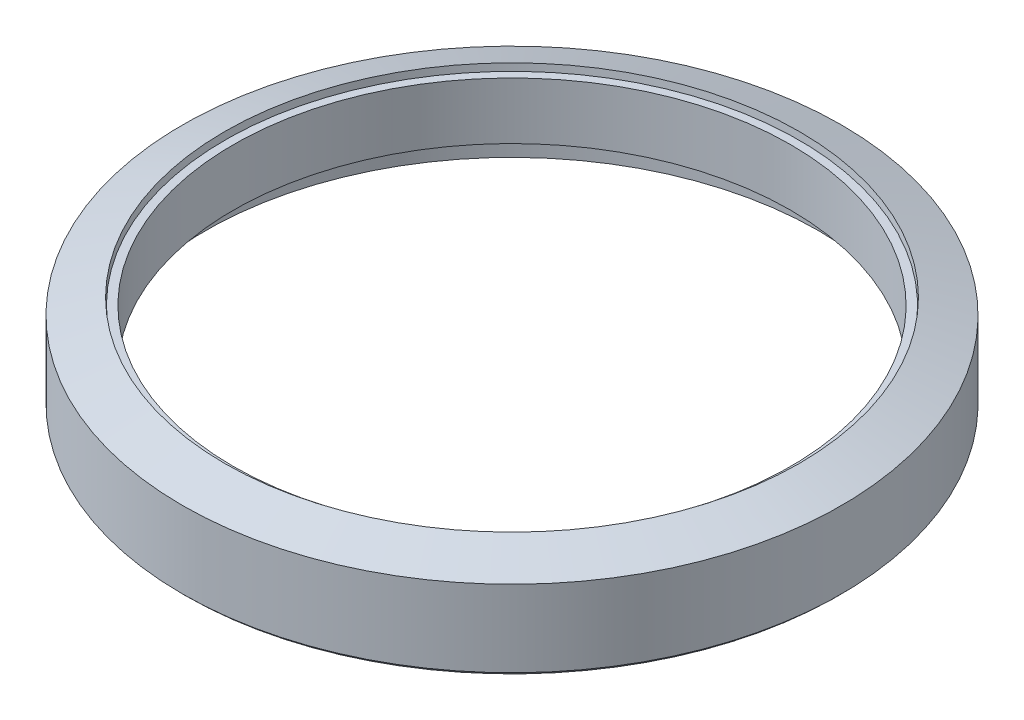
ISO-10303-21;
HEADER;
FILE_DESCRIPTION(('STEP AP214'),'2;1');
FILE_NAME('part.step','',(''),(''),'','','');
FILE_SCHEMA(('AUTOMOTIVE_DESIGN { 1 0 10303 214 1 1 1 1 }'));
ENDSEC;
DATA;
#1=APPLICATION_CONTEXT('core data for automotive mechanical design processes');
#2=APPLICATION_PROTOCOL_DEFINITION('international standard','automotive_design',2000,#1);
#3=PRODUCT_CONTEXT('',#1,'mechanical');
#4=PRODUCT('Part','Part','',(#3));
#5=PRODUCT_RELATED_PRODUCT_CATEGORY('part','',(#4));
#6=PRODUCT_DEFINITION_FORMATION('','',#4);
#7=PRODUCT_DEFINITION_CONTEXT('part definition',#1,'design');
#8=PRODUCT_DEFINITION('design','',#6,#7);
#9=PRODUCT_DEFINITION_SHAPE('','',#8);
#10=(LENGTH_UNIT() NAMED_UNIT(*) SI_UNIT(.MILLI.,.METRE.));
#11=(NAMED_UNIT(*) PLANE_ANGLE_UNIT() SI_UNIT($,.RADIAN.));
#12=(NAMED_UNIT(*) SI_UNIT($,.STERADIAN.) SOLID_ANGLE_UNIT());
#13=UNCERTAINTY_MEASURE_WITH_UNIT(LENGTH_MEASURE(1.E-05),#10,'distance_accuracy_value','');
#14=(GEOMETRIC_REPRESENTATION_CONTEXT(3) GLOBAL_UNCERTAINTY_ASSIGNED_CONTEXT((#13)) GLOBAL_UNIT_ASSIGNED_CONTEXT((#10,
#11,#12)) REPRESENTATION_CONTEXT('',''));
#15=CARTESIAN_POINT('',(0.,0.,0.));
#16=DIRECTION('',(0.,0.,1.));
#17=DIRECTION('',(1.,0.,0.));
#18=AXIS2_PLACEMENT_3D('',#15,#16,#17);
#19=CARTESIAN_POINT('',(0.,175.040200000015,0.));
#20=DIRECTION('',(0.,1.,0.));
#21=DIRECTION('',(0.,0.,1.));
#22=AXIS2_PLACEMENT_3D('',#19,#20,#21);
#23=CONICAL_SURFACE('',#22,20.9105557589292,0.087266462605737);
#24=CARTESIAN_POINT('',(0.,175.548200000038,0.));
#25=DIRECTION('',(0.,1.,0.));
#26=DIRECTION('',(0.,0.,1.));
#27=AXIS2_PLACEMENT_3D('',#24,#25,#26);
#28=CIRCLE('',#27,20.9550000000001);
#29=CARTESIAN_POINT('',(0.,175.548200000038,20.9550000000001));
#30=VERTEX_POINT('',#29);
#31=EDGE_CURVE('E30',#30,#30,#28,.T.);
#32=ORIENTED_EDGE('',*,*,#31,.T.);
#33=EDGE_LOOP('',(#32));
#34=FACE_BOUND('',#33,.T.);
#35=CARTESIAN_POINT('',(0.,175.040200000015,0.));
#36=DIRECTION('',(0.,1.,0.));
#37=DIRECTION('',(0.,0.,1.));
#38=AXIS2_PLACEMENT_3D('',#35,#36,#37);
#39=CIRCLE('',#38,20.9105557589292);
#40=CARTESIAN_POINT('',(0.,175.040200000015,20.9105557589292));
#41=VERTEX_POINT('',#40);
#42=EDGE_CURVE('E18',#41,#41,#39,.T.);
#43=ORIENTED_EDGE('',*,*,#42,.F.);
#44=EDGE_LOOP('',(#43));
#45=FACE_BOUND('',#44,.T.);
#46=ADVANCED_FACE('F14',(#34,#45),#23,.F.);
#47=CARTESIAN_POINT('',(-21.750939409,175.0402,-21.74697798929));
#48=DIRECTION('',(0.,1.,0.));
#49=DIRECTION('',(0.,0.,1.));
#50=AXIS2_PLACEMENT_3D('',#47,#48,#49);
#51=PLANE('',#50);
#52=CARTESIAN_POINT('',(0.,175.0402,0.));
#53=DIRECTION('',(0.,-1.,0.));
#54=DIRECTION('',(0.,0.,-1.));
#55=AXIS2_PLACEMENT_3D('',#52,#53,#54);
#56=CIRCLE('',#55,20.32);
#57=CARTESIAN_POINT('',(0.,175.0402,-20.32));
#58=VERTEX_POINT('',#57);
#59=EDGE_CURVE('E39',#58,#58,#56,.F.);
#60=ORIENTED_EDGE('',*,*,#59,.F.);
#61=EDGE_LOOP('',(#60));
#62=FACE_BOUND('',#61,.T.);
#63=ORIENTED_EDGE('',*,*,#42,.T.);
#64=EDGE_LOOP('',(#63));
#65=FACE_BOUND('',#64,.T.);
#66=ADVANCED_FACE('F50',(#62,#65),#51,.T.);
#67=CARTESIAN_POINT('',(0.,174.429573881962,0.));
#68=DIRECTION('',(0.,-1.,0.));
#69=DIRECTION('',(0.,0.,-1.));
#70=AXIS2_PLACEMENT_3D('',#67,#68,#69);
#71=CONICAL_SURFACE('',#70,24.0284,1.22173047637214);
#72=ORIENTED_EDGE('',*,*,#31,.F.);
#73=EDGE_LOOP('',(#72));
#74=FACE_BOUND('',#73,.T.);
#75=CARTESIAN_POINT('',(0.,174.429573881961,0.));
#76=DIRECTION('',(0.,1.,0.));
#77=DIRECTION('',(0.,0.,-1.));
#78=AXIS2_PLACEMENT_3D('',#75,#76,#77);
#79=CIRCLE('',#78,24.0284);
#80=CARTESIAN_POINT('',(0.,174.429573881961,-24.0284));
#81=VERTEX_POINT('',#80);
#82=EDGE_CURVE('E38',#81,#81,#79,.T.);
#83=ORIENTED_EDGE('',*,*,#82,.T.);
#84=EDGE_LOOP('',(#83));
#85=FACE_BOUND('',#84,.T.);
#86=ADVANCED_FACE('F58',(#74,#85),#71,.T.);
#87=CARTESIAN_POINT('',(0.,175.0402,0.));
#88=DIRECTION('',(0.,-1.,0.));
#89=DIRECTION('',(0.,0.,-1.));
#90=AXIS2_PLACEMENT_3D('',#87,#88,#89);
#91=CYLINDRICAL_SURFACE('',#90,20.32);
#92=ORIENTED_EDGE('',*,*,#59,.T.);
#93=EDGE_LOOP('',(#92));
#94=FACE_BOUND('',#93,.T.);
#95=CARTESIAN_POINT('',(0.,170.9,0.));
#96=DIRECTION('',(0.,-1.,0.));
#97=DIRECTION('',(0.,0.,-1.));
#98=AXIS2_PLACEMENT_3D('',#95,#96,#97);
#99=CIRCLE('',#98,20.32);
#100=CARTESIAN_POINT('',(0.,170.9,-20.32));
#101=VERTEX_POINT('',#100);
#102=EDGE_CURVE('E36',#101,#101,#99,.T.);
#103=ORIENTED_EDGE('',*,*,#102,.T.);
#104=EDGE_LOOP('',(#103));
#105=FACE_BOUND('',#104,.T.);
#106=ADVANCED_FACE('F87',(#94,#105),#91,.F.);
#107=CARTESIAN_POINT('',(0.,168.842600000038,0.));
#108=DIRECTION('',(0.,1.,0.));
#109=DIRECTION('',(0.,0.,1.));
#110=AXIS2_PLACEMENT_3D('',#107,#108,#109);
#111=CYLINDRICAL_SURFACE('',#110,24.0284);
#112=CARTESIAN_POINT('',(0.,168.842600000001,0.));
#113=DIRECTION('',(0.,1.,0.));
#114=DIRECTION('',(0.,0.,-1.));
#115=AXIS2_PLACEMENT_3D('',#112,#113,#114);
#116=CIRCLE('',#115,24.0284000000012);
#117=CARTESIAN_POINT('',(0.,168.842600000001,-24.0284000000012));
#118=VERTEX_POINT('',#117);
#119=EDGE_CURVE('E35',#118,#118,#116,.T.);
#120=ORIENTED_EDGE('',*,*,#119,.T.);
#121=EDGE_LOOP('',(#120));
#122=FACE_BOUND('',#121,.T.);
#123=ORIENTED_EDGE('',*,*,#82,.F.);
#124=EDGE_LOOP('',(#123));
#125=FACE_BOUND('',#124,.T.);
#126=ADVANCED_FACE('F81',(#122,#125),#111,.T.);
#127=CARTESIAN_POINT('',(-23.24608,170.9,-23.24608));
#128=DIRECTION('',(0.,1.,0.));
#129=DIRECTION('',(0.,0.,1.));
#130=AXIS2_PLACEMENT_3D('',#127,#128,#129);
#131=PLANE('',#130);
#132=ORIENTED_EDGE('',*,*,#102,.F.);
#133=EDGE_LOOP('',(#132));
#134=FACE_BOUND('',#133,.T.);
#135=CARTESIAN_POINT('',(0.,170.9,0.));
#136=DIRECTION('',(0.,1.,0.));
#137=DIRECTION('',(0.,0.,1.));
#138=AXIS2_PLACEMENT_3D('',#135,#136,#137);
#139=CIRCLE('',#138,22.352);
#140=CARTESIAN_POINT('',(0.,170.9,22.352));
#141=VERTEX_POINT('',#140);
#142=EDGE_CURVE('E27',#141,#141,#139,.T.);
#143=ORIENTED_EDGE('',*,*,#142,.F.);
#144=EDGE_LOOP('',(#143));
#145=FACE_BOUND('',#144,.T.);
#146=ADVANCED_FACE('F75',(#134,#145),#131,.F.);
#147=CARTESIAN_POINT('',(0.,168.588599999999,0.));
#148=DIRECTION('',(0.,1.,0.));
#149=DIRECTION('',(0.,0.,1.));
#150=AXIS2_PLACEMENT_3D('',#147,#148,#149);
#151=CONICAL_SURFACE('',#150,23.7743999999988,0.785398163397414);
#152=ORIENTED_EDGE('',*,*,#119,.F.);
#153=EDGE_LOOP('',(#152));
#154=FACE_BOUND('',#153,.T.);
#155=CARTESIAN_POINT('',(0.,168.588599999999,0.));
#156=DIRECTION('',(0.,1.,0.));
#157=DIRECTION('',(0.,0.,1.));
#158=AXIS2_PLACEMENT_3D('',#155,#156,#157);
#159=CIRCLE('',#158,23.7743999999988);
#160=CARTESIAN_POINT('',(0.,168.588599999999,23.7743999999988));
#161=VERTEX_POINT('',#160);
#162=EDGE_CURVE('E22',#161,#161,#159,.T.);
#163=ORIENTED_EDGE('',*,*,#162,.T.);
#164=EDGE_LOOP('',(#163));
#165=FACE_BOUND('',#164,.T.);
#166=ADVANCED_FACE('F68',(#154,#165),#151,.T.);
#167=CARTESIAN_POINT('',(0.,168.5886,0.));
#168=DIRECTION('',(0.,1.,0.));
#169=DIRECTION('',(0.,0.,1.));
#170=AXIS2_PLACEMENT_3D('',#167,#168,#169);
#171=CYLINDRICAL_SURFACE('',#170,22.352);
#172=ORIENTED_EDGE('',*,*,#142,.T.);
#173=EDGE_LOOP('',(#172));
#174=FACE_BOUND('',#173,.T.);
#175=CARTESIAN_POINT('',(0.,168.5886,0.));
#176=DIRECTION('',(0.,1.,0.));
#177=DIRECTION('',(0.,0.,1.));
#178=AXIS2_PLACEMENT_3D('',#175,#176,#177);
#179=CIRCLE('',#178,22.352);
#180=CARTESIAN_POINT('',(0.,168.5886,22.352));
#181=VERTEX_POINT('',#180);
#182=EDGE_CURVE('E10',#181,#181,#179,.F.);
#183=ORIENTED_EDGE('',*,*,#182,.T.);
#184=EDGE_LOOP('',(#183));
#185=FACE_BOUND('',#184,.T.);
#186=ADVANCED_FACE('F63',(#174,#185),#171,.F.);
#187=CARTESIAN_POINT('',(24.725376,168.5886,24.725376));
#188=DIRECTION('',(0.,1.,0.));
#189=DIRECTION('',(0.,0.,-1.));
#190=AXIS2_PLACEMENT_3D('',#187,#188,#189);
#191=PLANE('',#190);
#192=ORIENTED_EDGE('',*,*,#182,.F.);
#193=EDGE_LOOP('',(#192));
#194=FACE_BOUND('',#193,.T.);
#195=ORIENTED_EDGE('',*,*,#162,.F.);
#196=EDGE_LOOP('',(#195));
#197=FACE_BOUND('',#196,.T.);
#198=ADVANCED_FACE('F16',(#194,#197),#191,.F.);
#199=CLOSED_SHELL('',(#46,#66,#86,#106,#126,#146,#166,#186,#198));
#200=MANIFOLD_SOLID_BREP('B1',#199);
#201=ADVANCED_BREP_SHAPE_REPRESENTATION('',(#18,#200),#14);
#202=SHAPE_DEFINITION_REPRESENTATION(#9,#201);
ENDSEC;
END-ISO-10303-21;
